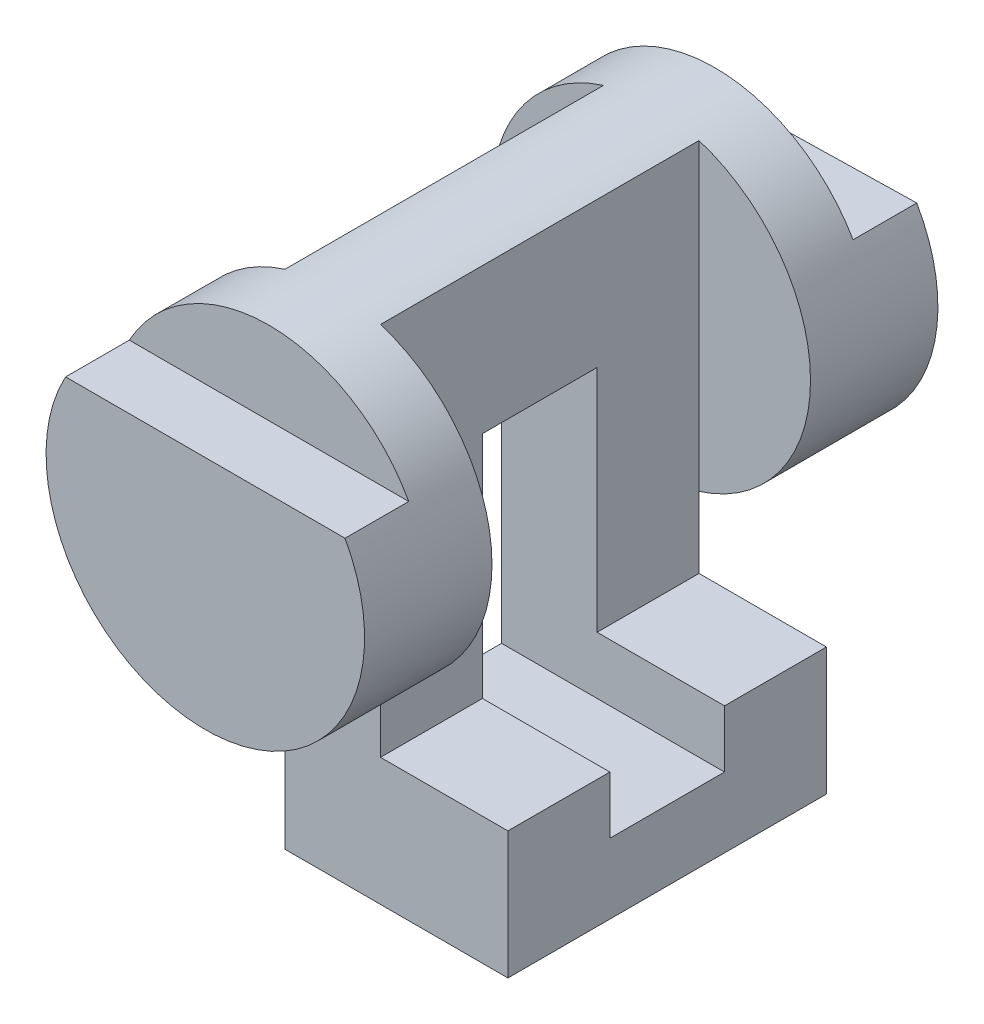
ISO-10303-21;
HEADER;
FILE_DESCRIPTION(('STEP AP214'),'2;1');
FILE_NAME('part.step','',(''),(''),'','','');
FILE_SCHEMA(('AUTOMOTIVE_DESIGN { 1 0 10303 214 1 1 1 1 }'));
ENDSEC;
DATA;
#1=APPLICATION_CONTEXT('core data for automotive mechanical design processes');
#2=APPLICATION_PROTOCOL_DEFINITION('international standard','automotive_design',2000,#1);
#3=PRODUCT_CONTEXT('',#1,'mechanical');
#4=PRODUCT('Part','Part','',(#3));
#5=PRODUCT_RELATED_PRODUCT_CATEGORY('part','',(#4));
#6=PRODUCT_DEFINITION_FORMATION('','',#4);
#7=PRODUCT_DEFINITION_CONTEXT('part definition',#1,'design');
#8=PRODUCT_DEFINITION('design','',#6,#7);
#9=PRODUCT_DEFINITION_SHAPE('','',#8);
#10=(LENGTH_UNIT() NAMED_UNIT(*) SI_UNIT(.MILLI.,.METRE.));
#11=(NAMED_UNIT(*) PLANE_ANGLE_UNIT() SI_UNIT($,.RADIAN.));
#12=(NAMED_UNIT(*) SI_UNIT($,.STERADIAN.) SOLID_ANGLE_UNIT());
#13=UNCERTAINTY_MEASURE_WITH_UNIT(LENGTH_MEASURE(1.E-05),#10,'distance_accuracy_value','');
#14=(GEOMETRIC_REPRESENTATION_CONTEXT(3) GLOBAL_UNCERTAINTY_ASSIGNED_CONTEXT((#13)) GLOBAL_UNIT_ASSIGNED_CONTEXT((#10,
#11,#12)) REPRESENTATION_CONTEXT('',''));
#15=CARTESIAN_POINT('',(0.,0.,0.));
#16=DIRECTION('',(0.,0.,1.));
#17=DIRECTION('',(1.,0.,0.));
#18=AXIS2_PLACEMENT_3D('',#15,#16,#17);
#19=CARTESIAN_POINT('',(-27.5,35.,22.6337448559671));
#20=DIRECTION('',(0.,0.,1.));
#21=DIRECTION('',(1.,0.,0.));
#22=AXIS2_PLACEMENT_3D('',#19,#20,#21);
#23=PLANE('',#22);
#24=CARTESIAN_POINT('',(-27.5,35.,22.6337448559671));
#25=DIRECTION('',(0.,0.,1.));
#26=DIRECTION('',(1.,0.,0.));
#27=AXIS2_PLACEMENT_3D('',#24,#25,#26);
#28=CIRCLE('',#27,25.);
#29=CARTESIAN_POINT('',(-35.,58.8484800354236,22.6337448559671));
#30=VERTEX_POINT('',#29);
#31=CARTESIAN_POINT('',(-35.,11.1515199645764,22.6337448559671));
#32=VERTEX_POINT('',#31);
#33=EDGE_CURVE('E203',#30,#32,#28,.T.);
#34=ORIENTED_EDGE('',*,*,#33,.F.);
#35=DIRECTION('',(0.,-1.,0.));
#36=VECTOR('',#35,1.);
#37=CARTESIAN_POINT('',(-35.,54.,22.6337448559671));
#38=LINE('',#37,#36);
#39=EDGE_CURVE('E235',#30,#32,#38,.T.);
#40=ORIENTED_EDGE('',*,*,#39,.T.);
#41=EDGE_LOOP('',(#34,#40));
#42=FACE_BOUND('',#41,.T.);
#43=ADVANCED_FACE('F37',(#42),#23,.F.);
#44=DIRECTION('',(0.,1.,0.));
#45=VECTOR('',#44,1.);
#46=CARTESIAN_POINT('',(-20.,0.,22.6337448559671));
#47=LINE('',#46,#45);
#48=CARTESIAN_POINT('',(-20.,11.1515199645764,22.6337448559671));
#49=VERTEX_POINT('',#48);
#50=CARTESIAN_POINT('',(-20.,58.8484800354236,22.6337448559671));
#51=VERTEX_POINT('',#50);
#52=EDGE_CURVE('E223',#49,#51,#47,.T.);
#53=ORIENTED_EDGE('',*,*,#52,.T.);
#54=EDGE_CURVE('E212',#49,#51,#28,.T.);
#55=ORIENTED_EDGE('',*,*,#54,.F.);
#56=EDGE_LOOP('',(#53,#55));
#57=FACE_BOUND('',#56,.T.);
#58=ADVANCED_FACE('F366',(#57),#23,.F.);
#59=CARTESIAN_POINT('',(-20.,0.,6.63374485596709));
#60=DIRECTION('',(0.,1.,0.));
#61=DIRECTION('',(0.,0.,1.));
#62=AXIS2_PLACEMENT_3D('',#59,#60,#61);
#63=PLANE('',#62);
#64=DIRECTION('',(0.,0.,1.));
#65=VECTOR('',#64,1.);
#66=CARTESIAN_POINT('',(0.,0.,6.63374485596709));
#67=LINE('',#66,#65);
#68=CARTESIAN_POINT('',(0.,0.,6.63374485596709));
#69=VERTEX_POINT('',#68);
#70=CARTESIAN_POINT('',(0.,0.,22.6337448559671));
#71=VERTEX_POINT('',#70);
#72=EDGE_CURVE('E240',#69,#71,#67,.T.);
#73=ORIENTED_EDGE('',*,*,#72,.F.);
#74=DIRECTION('',(1.,0.,0.));
#75=VECTOR('',#74,1.);
#76=CARTESIAN_POINT('',(-20.,0.,6.63374485596709));
#77=LINE('',#76,#75);
#78=CARTESIAN_POINT('',(-20.,0.,6.63374485596709));
#79=VERTEX_POINT('',#78);
#80=EDGE_CURVE('E271',#79,#69,#77,.T.);
#81=ORIENTED_EDGE('',*,*,#80,.F.);
#82=DIRECTION('',(0.,0.,1.));
#83=VECTOR('',#82,1.);
#84=CARTESIAN_POINT('',(-20.,0.,6.63374485596709));
#85=LINE('',#84,#83);
#86=CARTESIAN_POINT('',(-20.,0.,22.6337448559671));
#87=VERTEX_POINT('',#86);
#88=EDGE_CURVE('E241',#79,#87,#85,.T.);
#89=ORIENTED_EDGE('',*,*,#88,.T.);
#90=DIRECTION('',(1.,0.,0.));
#91=VECTOR('',#90,1.);
#92=CARTESIAN_POINT('',(-20.,0.,22.6337448559671));
#93=LINE('',#92,#91);
#94=EDGE_CURVE('E248',#87,#71,#93,.T.);
#95=ORIENTED_EDGE('',*,*,#94,.T.);
#96=EDGE_LOOP('',(#73,#81,#89,#95));
#97=FACE_BOUND('',#96,.T.);
#98=ADVANCED_FACE('F39',(#97),#63,.T.);
#99=CARTESIAN_POINT('',(-20.,-9.00000000000001,6.63374485596709));
#100=DIRECTION('',(0.,0.,-1.));
#101=DIRECTION('',(-1.,0.,0.));
#102=AXIS2_PLACEMENT_3D('',#99,#100,#101);
#103=PLANE('',#102);
#104=DIRECTION('',(0.,1.,0.));
#105=VECTOR('',#104,1.);
#106=CARTESIAN_POINT('',(0.,-9.00000000000001,6.63374485596709));
#107=LINE('',#106,#105);
#108=CARTESIAN_POINT('',(0.,-9.00000000000001,6.63374485596709));
#109=VERTEX_POINT('',#108);
#110=EDGE_CURVE('E245',#109,#69,#107,.T.);
#111=ORIENTED_EDGE('',*,*,#110,.F.);
#112=DIRECTION('',(1.,0.,0.));
#113=VECTOR('',#112,1.);
#114=CARTESIAN_POINT('',(-20.,-9.00000000000001,6.63374485596709));
#115=LINE('',#114,#113);
#116=CARTESIAN_POINT('',(-35.,-9.00000000000001,6.63374485596709));
#117=VERTEX_POINT('',#116);
#118=EDGE_CURVE('E274',#117,#109,#115,.T.);
#119=ORIENTED_EDGE('',*,*,#118,.F.);
#120=DIRECTION('',(0.,1.,0.));
#121=VECTOR('',#120,1.);
#122=CARTESIAN_POINT('',(-35.,54.,6.63374485596709));
#123=LINE('',#122,#121);
#124=CARTESIAN_POINT('',(-35.,36.,6.63374485596709));
#125=VERTEX_POINT('',#124);
#126=EDGE_CURVE('E291',#117,#125,#123,.T.);
#127=ORIENTED_EDGE('',*,*,#126,.T.);
#128=DIRECTION('',(1.,0.,0.));
#129=VECTOR('',#128,1.);
#130=CARTESIAN_POINT('',(-70.,36.,6.63374485596709));
#131=LINE('',#130,#129);
#132=CARTESIAN_POINT('',(-20.,36.,6.63374485596709));
#133=VERTEX_POINT('',#132);
#134=EDGE_CURVE('E221',#125,#133,#131,.T.);
#135=ORIENTED_EDGE('',*,*,#134,.T.);
#136=DIRECTION('',(0.,-1.,0.));
#137=VECTOR('',#136,1.);
#138=CARTESIAN_POINT('',(-20.,-9.00000000000001,6.63374485596709));
#139=LINE('',#138,#137);
#140=EDGE_CURVE('E218',#133,#79,#139,.T.);
#141=ORIENTED_EDGE('',*,*,#140,.T.);
#142=ORIENTED_EDGE('',*,*,#80,.T.);
#143=EDGE_LOOP('',(#111,#119,#127,#135,#141,#142));
#144=FACE_BOUND('',#143,.T.);
#145=ADVANCED_FACE('F310',(#144),#103,.T.);
#146=CARTESIAN_POINT('',(-20.,-9.,-11.3662551440329));
#147=DIRECTION('',(0.,1.,0.));
#148=DIRECTION('',(0.,0.,1.));
#149=AXIS2_PLACEMENT_3D('',#146,#147,#148);
#150=PLANE('',#149);
#151=DIRECTION('',(0.,0.,1.));
#152=VECTOR('',#151,1.);
#153=CARTESIAN_POINT('',(0.,-9.,-11.3662551440329));
#154=LINE('',#153,#152);
#155=CARTESIAN_POINT('',(0.,-9.,-11.3662551440329));
#156=VERTEX_POINT('',#155);
#157=EDGE_CURVE('E266',#156,#109,#154,.T.);
#158=ORIENTED_EDGE('',*,*,#157,.F.);
#159=DIRECTION('',(1.,0.,0.));
#160=VECTOR('',#159,1.);
#161=CARTESIAN_POINT('',(-20.,-9.,-11.3662551440329));
#162=LINE('',#161,#160);
#163=CARTESIAN_POINT('',(-35.,-9.,-11.3662551440329));
#164=VERTEX_POINT('',#163);
#165=EDGE_CURVE('E276',#164,#156,#162,.T.);
#166=ORIENTED_EDGE('',*,*,#165,.F.);
#167=DIRECTION('',(0.,0.,1.));
#168=VECTOR('',#167,1.);
#169=CARTESIAN_POINT('',(-35.,-9.00000000000001,-27.3662551440329));
#170=LINE('',#169,#168);
#171=EDGE_CURVE('E41',#164,#117,#170,.T.);
#172=ORIENTED_EDGE('',*,*,#171,.T.);
#173=ORIENTED_EDGE('',*,*,#118,.T.);
#174=EDGE_LOOP('',(#158,#166,#172,#173));
#175=FACE_BOUND('',#174,.T.);
#176=ADVANCED_FACE('F299',(#175),#150,.T.);
#177=CARTESIAN_POINT('',(-20.,0.,-11.3662551440329));
#178=DIRECTION('',(0.,0.,1.));
#179=DIRECTION('',(0.,-1.,0.));
#180=AXIS2_PLACEMENT_3D('',#177,#178,#179);
#181=PLANE('',#180);
#182=DIRECTION('',(0.,-1.,0.));
#183=VECTOR('',#182,1.);
#184=CARTESIAN_POINT('',(0.,0.,-11.3662551440329));
#185=LINE('',#184,#183);
#186=CARTESIAN_POINT('',(0.,0.,-11.3662551440329));
#187=VERTEX_POINT('',#186);
#188=EDGE_CURVE('E263',#187,#156,#185,.T.);
#189=ORIENTED_EDGE('',*,*,#188,.F.);
#190=DIRECTION('',(1.,0.,0.));
#191=VECTOR('',#190,1.);
#192=CARTESIAN_POINT('',(-20.,0.,-11.3662551440329));
#193=LINE('',#192,#191);
#194=CARTESIAN_POINT('',(-20.,0.,-11.3662551440329));
#195=VERTEX_POINT('',#194);
#196=EDGE_CURVE('E278',#195,#187,#193,.T.);
#197=ORIENTED_EDGE('',*,*,#196,.F.);
#198=DIRECTION('',(0.,1.,0.));
#199=VECTOR('',#198,1.);
#200=CARTESIAN_POINT('',(-20.,-9.,-11.3662551440329));
#201=LINE('',#200,#199);
#202=CARTESIAN_POINT('',(-20.,36.,-11.3662551440329));
#203=VERTEX_POINT('',#202);
#204=EDGE_CURVE('E208',#195,#203,#201,.T.);
#205=ORIENTED_EDGE('',*,*,#204,.T.);
#206=DIRECTION('',(1.,0.,0.));
#207=VECTOR('',#206,1.);
#208=CARTESIAN_POINT('',(-70.,36.,-11.3662551440329));
#209=LINE('',#208,#207);
#210=CARTESIAN_POINT('',(-35.,36.,-11.3662551440329));
#211=VERTEX_POINT('',#210);
#212=EDGE_CURVE('E220',#211,#203,#209,.T.);
#213=ORIENTED_EDGE('',*,*,#212,.F.);
#214=DIRECTION('',(0.,-1.,0.));
#215=VECTOR('',#214,1.);
#216=CARTESIAN_POINT('',(-35.,54.,-11.3662551440329));
#217=LINE('',#216,#215);
#218=EDGE_CURVE('E273',#211,#164,#217,.T.);
#219=ORIENTED_EDGE('',*,*,#218,.T.);
#220=ORIENTED_EDGE('',*,*,#165,.T.);
#221=EDGE_LOOP('',(#189,#197,#205,#213,#219,#220));
#222=FACE_BOUND('',#221,.T.);
#223=ADVANCED_FACE('F326',(#222),#181,.T.);
#224=CARTESIAN_POINT('',(-20.,0.,-27.3662551440329));
#225=DIRECTION('',(0.,1.,0.));
#226=DIRECTION('',(0.,0.,1.));
#227=AXIS2_PLACEMENT_3D('',#224,#225,#226);
#228=PLANE('',#227);
#229=DIRECTION('',(0.,0.,1.));
#230=VECTOR('',#229,1.);
#231=CARTESIAN_POINT('',(0.,0.,-27.3662551440329));
#232=LINE('',#231,#230);
#233=CARTESIAN_POINT('',(0.,0.,-27.3662551440329));
#234=VERTEX_POINT('',#233);
#235=EDGE_CURVE('E260',#234,#187,#232,.T.);
#236=ORIENTED_EDGE('',*,*,#235,.F.);
#237=DIRECTION('',(1.,0.,0.));
#238=VECTOR('',#237,1.);
#239=CARTESIAN_POINT('',(-20.,0.,-27.3662551440329));
#240=LINE('',#239,#238);
#241=CARTESIAN_POINT('',(-20.,0.,-27.3662551440329));
#242=VERTEX_POINT('',#241);
#243=EDGE_CURVE('E280',#242,#234,#240,.T.);
#244=ORIENTED_EDGE('',*,*,#243,.F.);
#245=DIRECTION('',(0.,0.,1.));
#246=VECTOR('',#245,1.);
#247=CARTESIAN_POINT('',(-20.,0.,-27.3662551440329));
#248=LINE('',#247,#246);
#249=EDGE_CURVE('E244',#242,#195,#248,.T.);
#250=ORIENTED_EDGE('',*,*,#249,.T.);
#251=ORIENTED_EDGE('',*,*,#196,.T.);
#252=EDGE_LOOP('',(#236,#244,#250,#251));
#253=FACE_BOUND('',#252,.T.);
#254=ADVANCED_FACE('F332',(#253),#228,.T.);
#255=CARTESIAN_POINT('',(-20.,-20.,-27.3662551440329));
#256=DIRECTION('',(0.,0.,-1.));
#257=DIRECTION('',(-1.,0.,0.));
#258=AXIS2_PLACEMENT_3D('',#255,#256,#257);
#259=PLANE('',#258);
#260=CARTESIAN_POINT('',(-27.5,35.,-27.3662551440329));
#261=DIRECTION('',(0.,0.,-1.));
#262=DIRECTION('',(-1.,0.,0.));
#263=AXIS2_PLACEMENT_3D('',#260,#261,#262);
#264=CIRCLE('',#263,24.9999999999981);
#265=CARTESIAN_POINT('',(-20.,11.1515199645783,-27.3662551440329));
#266=VERTEX_POINT('',#265);
#267=CARTESIAN_POINT('',(-35.,11.1515199645783,-27.3662551440329));
#268=VERTEX_POINT('',#267);
#269=EDGE_CURVE('E11',#266,#268,#264,.T.);
#270=ORIENTED_EDGE('',*,*,#269,.F.);
#271=DIRECTION('',(0.,1.,0.));
#272=VECTOR('',#271,1.);
#273=CARTESIAN_POINT('',(-20.,0.,-27.3662551440329));
#274=LINE('',#273,#272);
#275=EDGE_CURVE('E225',#242,#266,#274,.T.);
#276=ORIENTED_EDGE('',*,*,#275,.F.);
#277=ORIENTED_EDGE('',*,*,#243,.T.);
#278=DIRECTION('',(0.,1.,0.));
#279=VECTOR('',#278,1.);
#280=CARTESIAN_POINT('',(0.,-20.,-27.3662551440329));
#281=LINE('',#280,#279);
#282=CARTESIAN_POINT('',(0.,-20.,-27.3662551440329));
#283=VERTEX_POINT('',#282);
#284=EDGE_CURVE('E257',#283,#234,#281,.T.);
#285=ORIENTED_EDGE('',*,*,#284,.F.);
#286=DIRECTION('',(1.,0.,0.));
#287=VECTOR('',#286,1.);
#288=CARTESIAN_POINT('',(-20.,-20.,-27.3662551440329));
#289=LINE('',#288,#287);
#290=CARTESIAN_POINT('',(-35.,-20.,-27.3662551440329));
#291=VERTEX_POINT('',#290);
#292=EDGE_CURVE('E282',#291,#283,#289,.T.);
#293=ORIENTED_EDGE('',*,*,#292,.F.);
#294=DIRECTION('',(0.,-1.,0.));
#295=VECTOR('',#294,1.);
#296=CARTESIAN_POINT('',(-35.,54.,-27.3662551440329));
#297=LINE('',#296,#295);
#298=EDGE_CURVE('E227',#268,#291,#297,.T.);
#299=ORIENTED_EDGE('',*,*,#298,.F.);
#300=EDGE_LOOP('',(#270,#276,#277,#285,#293,#299));
#301=FACE_BOUND('',#300,.T.);
#302=ADVANCED_FACE('F330',(#301),#259,.T.);
#303=CARTESIAN_POINT('',(-20.,-20.,22.6337448559671));
#304=DIRECTION('',(0.,-1.,0.));
#305=DIRECTION('',(0.,0.,-1.));
#306=AXIS2_PLACEMENT_3D('',#303,#304,#305);
#307=PLANE('',#306);
#308=DIRECTION('',(0.,0.,-1.));
#309=VECTOR('',#308,1.);
#310=CARTESIAN_POINT('',(0.,-20.,22.6337448559671));
#311=LINE('',#310,#309);
#312=CARTESIAN_POINT('',(0.,-20.,22.6337448559671));
#313=VERTEX_POINT('',#312);
#314=EDGE_CURVE('E254',#313,#283,#311,.T.);
#315=ORIENTED_EDGE('',*,*,#314,.F.);
#316=DIRECTION('',(1.,0.,0.));
#317=VECTOR('',#316,1.);
#318=CARTESIAN_POINT('',(-20.,-20.,22.6337448559671));
#319=LINE('',#318,#317);
#320=CARTESIAN_POINT('',(-35.,-20.,22.6337448559671));
#321=VERTEX_POINT('',#320);
#322=EDGE_CURVE('E284',#321,#313,#319,.T.);
#323=ORIENTED_EDGE('',*,*,#322,.F.);
#324=DIRECTION('',(0.,0.,1.));
#325=VECTOR('',#324,1.);
#326=CARTESIAN_POINT('',(-35.,-20.,-27.3662551440329));
#327=LINE('',#326,#325);
#328=EDGE_CURVE('E231',#291,#321,#327,.T.);
#329=ORIENTED_EDGE('',*,*,#328,.F.);
#330=ORIENTED_EDGE('',*,*,#292,.T.);
#331=EDGE_LOOP('',(#315,#323,#329,#330));
#332=FACE_BOUND('',#331,.T.);
#333=ADVANCED_FACE('F339',(#332),#307,.T.);
#334=CARTESIAN_POINT('',(-20.,0.,22.6337448559671));
#335=DIRECTION('',(0.,0.,1.));
#336=DIRECTION('',(0.,-1.,0.));
#337=AXIS2_PLACEMENT_3D('',#334,#335,#336);
#338=PLANE('',#337);
#339=EDGE_CURVE('E209',#32,#49,#28,.T.);
#340=ORIENTED_EDGE('',*,*,#339,.F.);
#341=EDGE_CURVE('E234',#32,#321,#38,.T.);
#342=ORIENTED_EDGE('',*,*,#341,.T.);
#343=ORIENTED_EDGE('',*,*,#322,.T.);
#344=DIRECTION('',(0.,-1.,0.));
#345=VECTOR('',#344,1.);
#346=CARTESIAN_POINT('',(0.,0.,22.6337448559671));
#347=LINE('',#346,#345);
#348=EDGE_CURVE('E251',#71,#313,#347,.T.);
#349=ORIENTED_EDGE('',*,*,#348,.F.);
#350=ORIENTED_EDGE('',*,*,#94,.F.);
#351=EDGE_CURVE('E232',#87,#49,#47,.T.);
#352=ORIENTED_EDGE('',*,*,#351,.T.);
#353=EDGE_LOOP('',(#340,#342,#343,#349,#350,#352));
#354=FACE_BOUND('',#353,.T.);
#355=ADVANCED_FACE('F357',(#354),#338,.T.);
#356=CARTESIAN_POINT('',(0.,0.,0.));
#357=DIRECTION('',(1.,0.,0.));
#358=DIRECTION('',(0.,0.,-1.));
#359=AXIS2_PLACEMENT_3D('',#356,#357,#358);
#360=PLANE('',#359);
#361=ORIENTED_EDGE('',*,*,#72,.T.);
#362=ORIENTED_EDGE('',*,*,#348,.T.);
#363=ORIENTED_EDGE('',*,*,#314,.T.);
#364=ORIENTED_EDGE('',*,*,#284,.T.);
#365=ORIENTED_EDGE('',*,*,#235,.T.);
#366=ORIENTED_EDGE('',*,*,#188,.T.);
#367=ORIENTED_EDGE('',*,*,#157,.T.);
#368=ORIENTED_EDGE('',*,*,#110,.T.);
#369=EDGE_LOOP('',(#361,#362,#363,#364,#365,#366,#367,#368));
#370=FACE_BOUND('',#369,.T.);
#371=ADVANCED_FACE('F321',(#370),#360,.T.);
#372=CARTESIAN_POINT('',(-20.,0.,-27.3662551440329));
#373=DIRECTION('',(1.,0.,0.));
#374=DIRECTION('',(0.,0.,-1.));
#375=AXIS2_PLACEMENT_3D('',#372,#373,#374);
#376=PLANE('',#375);
#377=ORIENTED_EDGE('',*,*,#140,.F.);
#378=DIRECTION('',(0.,0.,1.));
#379=VECTOR('',#378,1.);
#380=CARTESIAN_POINT('',(-20.,36.,6.63374485596709));
#381=LINE('',#380,#379);
#382=EDGE_CURVE('E215',#203,#133,#381,.T.);
#383=ORIENTED_EDGE('',*,*,#382,.F.);
#384=ORIENTED_EDGE('',*,*,#204,.F.);
#385=ORIENTED_EDGE('',*,*,#249,.F.);
#386=ORIENTED_EDGE('',*,*,#275,.T.);
#387=CARTESIAN_POINT('',(-20.,58.8484800354236,-27.3662551440329));
#388=VERTEX_POINT('',#387);
#389=EDGE_CURVE('E228',#266,#388,#274,.T.);
#390=ORIENTED_EDGE('',*,*,#389,.T.);
#391=DIRECTION('',(0.,0.,1.));
#392=VECTOR('',#391,1.);
#393=CARTESIAN_POINT('',(-20.,58.8484800354236,-27.3662551440329));
#394=LINE('',#393,#392);
#395=EDGE_CURVE('E184',#388,#51,#394,.T.);
#396=ORIENTED_EDGE('',*,*,#395,.T.);
#397=ORIENTED_EDGE('',*,*,#52,.F.);
#398=ORIENTED_EDGE('',*,*,#351,.F.);
#399=ORIENTED_EDGE('',*,*,#88,.F.);
#400=EDGE_LOOP('',(#377,#383,#384,#385,#386,#390,#396,#397,#398,#399));
#401=FACE_BOUND('',#400,.T.);
#402=ADVANCED_FACE('F315',(#401),#376,.T.);
#403=CARTESIAN_POINT('',(-35.,54.,-27.3662551440329));
#404=DIRECTION('',(-1.,0.,0.));
#405=DIRECTION('',(0.,-1.,0.));
#406=AXIS2_PLACEMENT_3D('',#403,#404,#405);
#407=PLANE('',#406);
#408=ORIENTED_EDGE('',*,*,#171,.F.);
#409=ORIENTED_EDGE('',*,*,#218,.F.);
#410=DIRECTION('',(0.,0.,-1.));
#411=VECTOR('',#410,1.);
#412=CARTESIAN_POINT('',(-35.,36.,-27.3662551440329));
#413=LINE('',#412,#411);
#414=EDGE_CURVE('E289',#125,#211,#413,.T.);
#415=ORIENTED_EDGE('',*,*,#414,.F.);
#416=ORIENTED_EDGE('',*,*,#126,.F.);
#417=EDGE_LOOP('',(#408,#409,#415,#416));
#418=FACE_BOUND('',#417,.T.);
#419=ORIENTED_EDGE('',*,*,#39,.F.);
#420=DIRECTION('',(0.,0.,1.));
#421=VECTOR('',#420,1.);
#422=CARTESIAN_POINT('',(-35.,58.8484800354236,-27.3662551440329));
#423=LINE('',#422,#421);
#424=CARTESIAN_POINT('',(-35.,58.8484800354236,-27.3662551440329));
#425=VERTEX_POINT('',#424);
#426=EDGE_CURVE('E189',#425,#30,#423,.T.);
#427=ORIENTED_EDGE('',*,*,#426,.F.);
#428=EDGE_CURVE('E229',#425,#268,#297,.T.);
#429=ORIENTED_EDGE('',*,*,#428,.T.);
#430=ORIENTED_EDGE('',*,*,#298,.T.);
#431=ORIENTED_EDGE('',*,*,#328,.T.);
#432=ORIENTED_EDGE('',*,*,#341,.F.);
#433=EDGE_LOOP('',(#419,#427,#429,#430,#431,#432));
#434=FACE_BOUND('',#433,.T.);
#435=ADVANCED_FACE('F303',(#418,#434),#407,.T.);
#436=CARTESIAN_POINT('',(-70.,36.,6.63374485596709));
#437=DIRECTION('',(0.,1.,0.));
#438=DIRECTION('',(0.,0.,1.));
#439=AXIS2_PLACEMENT_3D('',#436,#437,#438);
#440=PLANE('',#439);
#441=ORIENTED_EDGE('',*,*,#414,.T.);
#442=ORIENTED_EDGE('',*,*,#212,.T.);
#443=ORIENTED_EDGE('',*,*,#382,.T.);
#444=ORIENTED_EDGE('',*,*,#134,.F.);
#445=EDGE_LOOP('',(#441,#442,#443,#444));
#446=FACE_BOUND('',#445,.T.);
#447=ADVANCED_FACE('F306',(#446),#440,.F.);
#448=CARTESIAN_POINT('',(-27.5,35.,42.6337448559671));
#449=DIRECTION('',(0.,0.,-1.));
#450=DIRECTION('',(-1.,0.,0.));
#451=AXIS2_PLACEMENT_3D('',#448,#449,#450);
#452=CYLINDRICAL_SURFACE('',#451,25.);
#453=CARTESIAN_POINT('',(-27.5,35.,42.6337448559671));
#454=DIRECTION('',(0.,0.,1.));
#455=DIRECTION('',(1.,0.,0.));
#456=AXIS2_PLACEMENT_3D('',#453,#454,#455);
#457=CIRCLE('',#456,25.);
#458=CARTESIAN_POINT('',(-49.4317121994613,47.,42.6337448559671));
#459=VERTEX_POINT('',#458);
#460=CARTESIAN_POINT('',(-5.56828780053869,47.,42.6337448559671));
#461=VERTEX_POINT('',#460);
#462=EDGE_CURVE('E205',#459,#461,#457,.T.);
#463=ORIENTED_EDGE('',*,*,#462,.F.);
#464=DIRECTION('',(0.,0.,1.));
#465=VECTOR('',#464,1.);
#466=CARTESIAN_POINT('',(-49.4317121994613,47.,32.6337448559671));
#467=LINE('',#466,#465);
#468=CARTESIAN_POINT('',(-49.4317121994613,47.,32.6337448559671));
#469=VERTEX_POINT('',#468);
#470=EDGE_CURVE('E198',#469,#459,#467,.T.);
#471=ORIENTED_EDGE('',*,*,#470,.F.);
#472=CARTESIAN_POINT('',(-27.5,35.,32.6337448559671));
#473=DIRECTION('',(0.,0.,1.));
#474=DIRECTION('',(-1.,0.,0.));
#475=AXIS2_PLACEMENT_3D('',#472,#473,#474);
#476=CIRCLE('',#475,25.);
#477=CARTESIAN_POINT('',(-5.56828780053869,47.,32.6337448559671));
#478=VERTEX_POINT('',#477);
#479=EDGE_CURVE('E193',#478,#469,#476,.T.);
#480=ORIENTED_EDGE('',*,*,#479,.F.);
#481=DIRECTION('',(0.,0.,1.));
#482=VECTOR('',#481,1.);
#483=CARTESIAN_POINT('',(-5.56828780053869,47.,32.6337448559671));
#484=LINE('',#483,#482);
#485=EDGE_CURVE('E200',#478,#461,#484,.T.);
#486=ORIENTED_EDGE('',*,*,#485,.T.);
#487=EDGE_LOOP('',(#463,#471,#480,#486));
#488=FACE_BOUND('',#487,.T.);
#489=ORIENTED_EDGE('',*,*,#339,.T.);
#490=ORIENTED_EDGE('',*,*,#54,.T.);
#491=ORIENTED_EDGE('',*,*,#395,.F.);
#492=EDGE_CURVE('E48',#388,#266,#264,.T.);
#493=ORIENTED_EDGE('',*,*,#492,.T.);
#494=ORIENTED_EDGE('',*,*,#269,.T.);
#495=EDGE_CURVE('E47',#268,#425,#264,.T.);
#496=ORIENTED_EDGE('',*,*,#495,.T.);
#497=ORIENTED_EDGE('',*,*,#426,.T.);
#498=ORIENTED_EDGE('',*,*,#33,.T.);
#499=EDGE_LOOP('',(#489,#490,#491,#493,#494,#496,#497,#498));
#500=FACE_BOUND('',#499,.T.);
#501=CARTESIAN_POINT('',(-27.5,35.,-37.3662551440329));
#502=DIRECTION('',(0.,0.,-1.));
#503=DIRECTION('',(1.,0.,0.));
#504=AXIS2_PLACEMENT_3D('',#501,#502,#503);
#505=CIRCLE('',#504,24.9999999999981);
#506=CARTESIAN_POINT('',(-49.6748020705755,46.5446157636669,-37.3662551440329));
#507=VERTEX_POINT('',#506);
#508=CARTESIAN_POINT('',(-5.82072821287379,47.4502680605608,-37.3662551440329));
#509=VERTEX_POINT('',#508);
#510=EDGE_CURVE('E166',#507,#509,#505,.T.);
#511=ORIENTED_EDGE('',*,*,#510,.F.);
#512=DIRECTION('',(0.,0.,-1.));
#513=VECTOR('',#512,1.);
#514=CARTESIAN_POINT('',(-49.6748020705755,46.5446157636669,-37.3662551440329));
#515=LINE('',#514,#513);
#516=CARTESIAN_POINT('',(-49.6748020705755,46.5446157636669,-47.3662551440329));
#517=VERTEX_POINT('',#516);
#518=EDGE_CURVE('E174',#507,#517,#515,.T.);
#519=ORIENTED_EDGE('',*,*,#518,.T.);
#520=CARTESIAN_POINT('',(-27.5,35.,-47.3662551440329));
#521=DIRECTION('',(0.,0.,-1.));
#522=DIRECTION('',(-1.,0.,0.));
#523=AXIS2_PLACEMENT_3D('',#520,#521,#522);
#524=CIRCLE('',#523,24.9999999999981);
#525=CARTESIAN_POINT('',(-5.82072821287379,47.4502680605608,-47.3662551440329));
#526=VERTEX_POINT('',#525);
#527=EDGE_CURVE('E179',#526,#517,#524,.T.);
#528=ORIENTED_EDGE('',*,*,#527,.F.);
#529=DIRECTION('',(0.,0.,-1.));
#530=VECTOR('',#529,1.);
#531=CARTESIAN_POINT('',(-5.82072821287379,47.4502680605608,-37.3662551440329));
#532=LINE('',#531,#530);
#533=EDGE_CURVE('E55',#509,#526,#532,.T.);
#534=ORIENTED_EDGE('',*,*,#533,.F.);
#535=EDGE_LOOP('',(#511,#519,#528,#534));
#536=FACE_BOUND('',#535,.T.);
#537=ADVANCED_FACE('F177',(#488,#500,#536),#452,.T.);
#538=CARTESIAN_POINT('',(-27.5,35.,42.6337448559671));
#539=DIRECTION('',(0.,0.,1.));
#540=DIRECTION('',(1.,0.,0.));
#541=AXIS2_PLACEMENT_3D('',#538,#539,#540);
#542=PLANE('',#541);
#543=DIRECTION('',(1.,0.,0.));
#544=VECTOR('',#543,1.);
#545=CARTESIAN_POINT('',(-49.4317121994613,47.,42.6337448559671));
#546=LINE('',#545,#544);
#547=EDGE_CURVE('E192',#459,#461,#546,.T.);
#548=ORIENTED_EDGE('',*,*,#547,.F.);
#549=ORIENTED_EDGE('',*,*,#462,.T.);
#550=EDGE_LOOP('',(#548,#549));
#551=FACE_BOUND('',#550,.T.);
#552=ADVANCED_FACE('F373',(#551),#542,.T.);
#553=CARTESIAN_POINT('',(-49.4317121994613,47.,32.6337448559671));
#554=DIRECTION('',(0.,-1.,0.));
#555=DIRECTION('',(0.,0.,-1.));
#556=AXIS2_PLACEMENT_3D('',#553,#554,#555);
#557=PLANE('',#556);
#558=ORIENTED_EDGE('',*,*,#547,.T.);
#559=ORIENTED_EDGE('',*,*,#485,.F.);
#560=DIRECTION('',(1.,0.,0.));
#561=VECTOR('',#560,1.);
#562=CARTESIAN_POINT('',(-49.4317121994613,47.,32.6337448559671));
#563=LINE('',#562,#561);
#564=EDGE_CURVE('E195',#469,#478,#563,.T.);
#565=ORIENTED_EDGE('',*,*,#564,.F.);
#566=ORIENTED_EDGE('',*,*,#470,.T.);
#567=EDGE_LOOP('',(#558,#559,#565,#566));
#568=FACE_BOUND('',#567,.T.);
#569=ADVANCED_FACE('F467',(#568),#557,.F.);
#570=CARTESIAN_POINT('',(-27.5,35.,32.6337448559671));
#571=DIRECTION('',(0.,0.,-1.));
#572=DIRECTION('',(-1.,0.,0.));
#573=AXIS2_PLACEMENT_3D('',#570,#571,#572);
#574=PLANE('',#573);
#575=ORIENTED_EDGE('',*,*,#479,.T.);
#576=ORIENTED_EDGE('',*,*,#564,.T.);
#577=EDGE_LOOP('',(#575,#576));
#578=FACE_BOUND('',#577,.T.);
#579=ADVANCED_FACE('F477',(#578),#574,.F.);
#580=CARTESIAN_POINT('',(-27.5,35.,-27.3662551440329));
#581=DIRECTION('',(0.,0.,-1.));
#582=DIRECTION('',(-1.,0.,0.));
#583=AXIS2_PLACEMENT_3D('',#580,#581,#582);
#584=PLANE('',#583);
#585=ORIENTED_EDGE('',*,*,#428,.F.);
#586=ORIENTED_EDGE('',*,*,#495,.F.);
#587=EDGE_LOOP('',(#585,#586));
#588=FACE_BOUND('',#587,.T.);
#589=ADVANCED_FACE('F343',(#588),#584,.F.);
#590=CARTESIAN_POINT('',(-27.5,35.,-47.3662551440329));
#591=DIRECTION('',(0.,0.,-1.));
#592=DIRECTION('',(-1.,0.,0.));
#593=AXIS2_PLACEMENT_3D('',#590,#591,#592);
#594=PLANE('',#593);
#595=DIRECTION('',(-0.999786826009488,-0.0206470951437227,0.));
#596=VECTOR('',#595,1.);
#597=CARTESIAN_POINT('',(-5.82072821287379,47.4502680605608,-47.3662551440329));
#598=LINE('',#597,#596);
#599=EDGE_CURVE('E171',#526,#517,#598,.T.);
#600=ORIENTED_EDGE('',*,*,#599,.F.);
#601=ORIENTED_EDGE('',*,*,#527,.T.);
#602=EDGE_LOOP('',(#600,#601));
#603=FACE_BOUND('',#602,.T.);
#604=ADVANCED_FACE('F584',(#603),#594,.T.);
#605=ORIENTED_EDGE('',*,*,#389,.F.);
#606=ORIENTED_EDGE('',*,*,#492,.F.);
#607=EDGE_LOOP('',(#605,#606));
#608=FACE_BOUND('',#607,.T.);
#609=ADVANCED_FACE('F351',(#608),#584,.F.);
#610=CARTESIAN_POINT('',(-5.82072821287379,47.4502680605608,-37.3662551440329));
#611=DIRECTION('',(0.0206470951437227,-0.999786826009488,0.));
#612=DIRECTION('',(0.999786826009488,0.0206470951437227,0.));
#613=AXIS2_PLACEMENT_3D('',#610,#611,#612);
#614=PLANE('',#613);
#615=ORIENTED_EDGE('',*,*,#599,.T.);
#616=ORIENTED_EDGE('',*,*,#518,.F.);
#617=DIRECTION('',(-0.999786826009488,-0.0206470951437227,0.));
#618=VECTOR('',#617,1.);
#619=CARTESIAN_POINT('',(-5.82072821287379,47.4502680605608,-37.3662551440329));
#620=LINE('',#619,#618);
#621=EDGE_CURVE('E168',#509,#507,#620,.T.);
#622=ORIENTED_EDGE('',*,*,#621,.F.);
#623=ORIENTED_EDGE('',*,*,#533,.T.);
#624=EDGE_LOOP('',(#615,#616,#622,#623));
#625=FACE_BOUND('',#624,.T.);
#626=ADVANCED_FACE('F173',(#625),#614,.F.);
#627=CARTESIAN_POINT('',(-27.5,35.,-37.3662551440329));
#628=DIRECTION('',(0.,0.,1.));
#629=DIRECTION('',(1.,0.,0.));
#630=AXIS2_PLACEMENT_3D('',#627,#628,#629);
#631=PLANE('',#630);
#632=ORIENTED_EDGE('',*,*,#510,.T.);
#633=ORIENTED_EDGE('',*,*,#621,.T.);
#634=EDGE_LOOP('',(#632,#633));
#635=FACE_BOUND('',#634,.T.);
#636=ADVANCED_FACE('F167',(#635),#631,.F.);
#637=CLOSED_SHELL('',(#43,#58,#98,#145,#176,#223,#254,#302,#333,#355,#371,#402,#435,#447,#537,
#552,#569,#579,#589,#604,#609,#626,#636));
#638=MANIFOLD_SOLID_BREP('B2',#637);
#639=ADVANCED_BREP_SHAPE_REPRESENTATION('',(#18,#638),#14);
#640=SHAPE_DEFINITION_REPRESENTATION(#9,#639);
ENDSEC;
END-ISO-10303-21;
